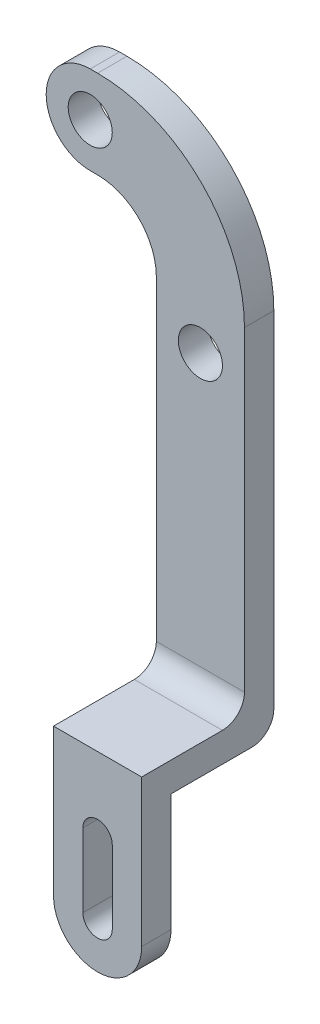
ISO-10303-21;
HEADER;
FILE_DESCRIPTION(('STEP AP214'),'2;1');
FILE_NAME('part.step','',(''),(''),'','','');
FILE_SCHEMA(('AUTOMOTIVE_DESIGN { 1 0 10303 214 1 1 1 1 }'));
ENDSEC;
DATA;
#1=APPLICATION_CONTEXT('core data for automotive mechanical design processes');
#2=APPLICATION_PROTOCOL_DEFINITION('international standard','automotive_design',2000,#1);
#3=PRODUCT_CONTEXT('',#1,'mechanical');
#4=PRODUCT('Part','Part','',(#3));
#5=PRODUCT_RELATED_PRODUCT_CATEGORY('part','',(#4));
#6=PRODUCT_DEFINITION_FORMATION('','',#4);
#7=PRODUCT_DEFINITION_CONTEXT('part definition',#1,'design');
#8=PRODUCT_DEFINITION('design','',#6,#7);
#9=PRODUCT_DEFINITION_SHAPE('','',#8);
#10=(LENGTH_UNIT() NAMED_UNIT(*) SI_UNIT(.MILLI.,.METRE.));
#11=(NAMED_UNIT(*) PLANE_ANGLE_UNIT() SI_UNIT($,.RADIAN.));
#12=(NAMED_UNIT(*) SI_UNIT($,.STERADIAN.) SOLID_ANGLE_UNIT());
#13=UNCERTAINTY_MEASURE_WITH_UNIT(LENGTH_MEASURE(1.E-05),#10,'distance_accuracy_value','');
#14=(GEOMETRIC_REPRESENTATION_CONTEXT(3) GLOBAL_UNCERTAINTY_ASSIGNED_CONTEXT((#13)) GLOBAL_UNIT_ASSIGNED_CONTEXT((#10,
#11,#12)) REPRESENTATION_CONTEXT('',''));
#15=CARTESIAN_POINT('',(0.,0.,0.));
#16=DIRECTION('',(0.,0.,1.));
#17=DIRECTION('',(1.,0.,0.));
#18=AXIS2_PLACEMENT_3D('',#15,#16,#17);
#19=CARTESIAN_POINT('',(-90.6722088265984,8.59964606378788,4.));
#20=DIRECTION('',(0.,0.,-1.));
#21=DIRECTION('',(-1.,0.,0.));
#22=AXIS2_PLACEMENT_3D('',#19,#20,#21);
#23=CYLINDRICAL_SURFACE('',#22,6.00000000000001);
#24=CARTESIAN_POINT('',(-90.6722088265984,8.59964606378788,14.));
#25=DIRECTION('',(0.,0.,-1.));
#26=DIRECTION('',(-1.,0.,0.));
#27=AXIS2_PLACEMENT_3D('',#24,#25,#26);
#28=CIRCLE('',#27,6.00000000000001);
#29=CARTESIAN_POINT('',(-84.6722088265984,8.59964606378788,14.));
#30=VERTEX_POINT('',#29);
#31=CARTESIAN_POINT('',(-96.6722088265984,8.59964606378788,14.));
#32=VERTEX_POINT('',#31);
#33=EDGE_CURVE('E571',#30,#32,#28,.T.);
#34=ORIENTED_EDGE('',*,*,#33,.F.);
#35=DIRECTION('',(0.,0.,-1.));
#36=VECTOR('',#35,1.);
#37=CARTESIAN_POINT('',(-84.6722088265984,8.59964606378788,4.));
#38=LINE('',#37,#36);
#39=CARTESIAN_POINT('',(-84.6722088265984,8.59964606378788,18.));
#40=VERTEX_POINT('',#39);
#41=EDGE_CURVE('E247',#40,#30,#38,.T.);
#42=ORIENTED_EDGE('',*,*,#41,.F.);
#43=CARTESIAN_POINT('',(-90.6722088265984,8.59964606378788,18.));
#44=DIRECTION('',(0.,0.,-1.));
#45=DIRECTION('',(-1.,0.,0.));
#46=AXIS2_PLACEMENT_3D('',#43,#44,#45);
#47=CIRCLE('',#46,6.00000000000001);
#48=CARTESIAN_POINT('',(-96.6722088265984,8.59964606378788,18.));
#49=VERTEX_POINT('',#48);
#50=EDGE_CURVE('E314',#40,#49,#47,.T.);
#51=ORIENTED_EDGE('',*,*,#50,.T.);
#52=DIRECTION('',(0.,0.,-1.));
#53=VECTOR('',#52,1.);
#54=CARTESIAN_POINT('',(-96.6722088265984,8.59964606378788,4.));
#55=LINE('',#54,#53);
#56=EDGE_CURVE('E238',#49,#32,#55,.T.);
#57=ORIENTED_EDGE('',*,*,#56,.T.);
#58=EDGE_LOOP('',(#34,#42,#51,#57));
#59=FACE_BOUND('',#58,.T.);
#60=ADVANCED_FACE('F32',(#59),#23,.T.);
#61=CARTESIAN_POINT('',(-90.6722088265984,8.59964606378788,4.));
#62=DIRECTION('',(0.,0.,-1.));
#63=DIRECTION('',(-1.,0.,0.));
#64=AXIS2_PLACEMENT_3D('',#61,#62,#63);
#65=CYLINDRICAL_SURFACE('',#64,2.);
#66=DIRECTION('',(0.,0.,-1.));
#67=VECTOR('',#66,1.);
#68=CARTESIAN_POINT('',(-88.6722088265984,8.59964606378788,4.));
#69=LINE('',#68,#67);
#70=CARTESIAN_POINT('',(-88.6722088265984,8.59964606378788,18.));
#71=VERTEX_POINT('',#70);
#72=CARTESIAN_POINT('',(-88.6722088265984,8.59964606378788,14.));
#73=VERTEX_POINT('',#72);
#74=EDGE_CURVE('E174',#71,#73,#69,.T.);
#75=ORIENTED_EDGE('',*,*,#74,.T.);
#76=CARTESIAN_POINT('',(-90.6722088265984,8.59964606378788,14.));
#77=DIRECTION('',(0.,0.,-1.));
#78=DIRECTION('',(-1.,0.,0.));
#79=AXIS2_PLACEMENT_3D('',#76,#77,#78);
#80=CIRCLE('',#79,2.);
#81=CARTESIAN_POINT('',(-92.6722088265984,8.59964606378788,14.));
#82=VERTEX_POINT('',#81);
#83=EDGE_CURVE('E160',#73,#82,#80,.T.);
#84=ORIENTED_EDGE('',*,*,#83,.T.);
#85=DIRECTION('',(0.,0.,-1.));
#86=VECTOR('',#85,1.);
#87=CARTESIAN_POINT('',(-92.6722088265984,8.59964606378788,4.));
#88=LINE('',#87,#86);
#89=CARTESIAN_POINT('',(-92.6722088265984,8.59964606378788,18.));
#90=VERTEX_POINT('',#89);
#91=EDGE_CURVE('E172',#90,#82,#88,.T.);
#92=ORIENTED_EDGE('',*,*,#91,.F.);
#93=CARTESIAN_POINT('',(-90.6722088265984,8.59964606378788,18.));
#94=DIRECTION('',(0.,0.,-1.));
#95=DIRECTION('',(-1.,0.,0.));
#96=AXIS2_PLACEMENT_3D('',#93,#94,#95);
#97=CIRCLE('',#96,2.);
#98=EDGE_CURVE('E298',#71,#90,#97,.T.);
#99=ORIENTED_EDGE('',*,*,#98,.F.);
#100=EDGE_LOOP('',(#75,#84,#92,#99));
#101=FACE_BOUND('',#100,.T.);
#102=ADVANCED_FACE('F170',(#101),#65,.F.);
#103=CARTESIAN_POINT('',(-88.6722088265984,8.59964606378788,4.));
#104=DIRECTION('',(-1.,0.,0.));
#105=DIRECTION('',(0.,0.,1.));
#106=AXIS2_PLACEMENT_3D('',#103,#104,#105);
#107=PLANE('',#106);
#108=DIRECTION('',(0.,0.,-1.));
#109=VECTOR('',#108,1.);
#110=CARTESIAN_POINT('',(-88.6722088265984,18.5996460637879,4.));
#111=LINE('',#110,#109);
#112=CARTESIAN_POINT('',(-88.6722088265984,18.5996460637879,18.));
#113=VERTEX_POINT('',#112);
#114=CARTESIAN_POINT('',(-88.6722088265984,18.5996460637879,14.));
#115=VERTEX_POINT('',#114);
#116=EDGE_CURVE('E183',#113,#115,#111,.T.);
#117=ORIENTED_EDGE('',*,*,#116,.T.);
#118=DIRECTION('',(0.,-1.,0.));
#119=VECTOR('',#118,1.);
#120=CARTESIAN_POINT('',(-88.6722088265984,8.59964606378788,14.));
#121=LINE('',#120,#119);
#122=EDGE_CURVE('E574',#115,#73,#121,.T.);
#123=ORIENTED_EDGE('',*,*,#122,.T.);
#124=ORIENTED_EDGE('',*,*,#74,.F.);
#125=DIRECTION('',(0.,-1.,0.));
#126=VECTOR('',#125,1.);
#127=CARTESIAN_POINT('',(-88.6722088265984,8.59964606378788,18.));
#128=LINE('',#127,#126);
#129=EDGE_CURVE('E309',#113,#71,#128,.T.);
#130=ORIENTED_EDGE('',*,*,#129,.F.);
#131=EDGE_LOOP('',(#117,#123,#124,#130));
#132=FACE_BOUND('',#131,.T.);
#133=ADVANCED_FACE('F349',(#132),#107,.T.);
#134=CARTESIAN_POINT('',(-90.6722088265984,18.5996460637879,4.));
#135=DIRECTION('',(0.,0.,-1.));
#136=DIRECTION('',(-1.,0.,0.));
#137=AXIS2_PLACEMENT_3D('',#134,#135,#136);
#138=CYLINDRICAL_SURFACE('',#137,2.);
#139=DIRECTION('',(0.,0.,-1.));
#140=VECTOR('',#139,1.);
#141=CARTESIAN_POINT('',(-92.6722088265984,18.5996460637879,4.));
#142=LINE('',#141,#140);
#143=CARTESIAN_POINT('',(-92.6722088265984,18.5996460637879,18.));
#144=VERTEX_POINT('',#143);
#145=CARTESIAN_POINT('',(-92.6722088265984,18.5996460637879,14.));
#146=VERTEX_POINT('',#145);
#147=EDGE_CURVE('E180',#144,#146,#142,.T.);
#148=ORIENTED_EDGE('',*,*,#147,.T.);
#149=CARTESIAN_POINT('',(-90.6722088265984,18.5996460637879,14.));
#150=DIRECTION('',(0.,0.,-1.));
#151=DIRECTION('',(-1.,0.,0.));
#152=AXIS2_PLACEMENT_3D('',#149,#150,#151);
#153=CIRCLE('',#152,2.);
#154=EDGE_CURVE('E163',#146,#115,#153,.T.);
#155=ORIENTED_EDGE('',*,*,#154,.T.);
#156=ORIENTED_EDGE('',*,*,#116,.F.);
#157=CARTESIAN_POINT('',(-90.6722088265984,18.5996460637879,18.));
#158=DIRECTION('',(0.,0.,-1.));
#159=DIRECTION('',(-1.,0.,0.));
#160=AXIS2_PLACEMENT_3D('',#157,#158,#159);
#161=CIRCLE('',#160,2.);
#162=EDGE_CURVE('E306',#144,#113,#161,.T.);
#163=ORIENTED_EDGE('',*,*,#162,.F.);
#164=EDGE_LOOP('',(#148,#155,#156,#163));
#165=FACE_BOUND('',#164,.T.);
#166=ADVANCED_FACE('F417',(#165),#138,.F.);
#167=CARTESIAN_POINT('',(-92.6722088265984,8.59964606378788,4.));
#168=DIRECTION('',(1.,0.,0.));
#169=DIRECTION('',(0.,0.,-1.));
#170=AXIS2_PLACEMENT_3D('',#167,#168,#169);
#171=PLANE('',#170);
#172=ORIENTED_EDGE('',*,*,#91,.T.);
#173=DIRECTION('',(0.,1.,0.));
#174=VECTOR('',#173,1.);
#175=CARTESIAN_POINT('',(-92.6722088265984,18.5996460637879,14.));
#176=LINE('',#175,#174);
#177=EDGE_CURVE('E156',#82,#146,#176,.T.);
#178=ORIENTED_EDGE('',*,*,#177,.T.);
#179=ORIENTED_EDGE('',*,*,#147,.F.);
#180=DIRECTION('',(0.,1.,0.));
#181=VECTOR('',#180,1.);
#182=CARTESIAN_POINT('',(-92.6722088265984,18.5996460637879,18.));
#183=LINE('',#182,#181);
#184=EDGE_CURVE('E178',#90,#144,#183,.T.);
#185=ORIENTED_EDGE('',*,*,#184,.F.);
#186=EDGE_LOOP('',(#172,#178,#179,#185));
#187=FACE_BOUND('',#186,.T.);
#188=ADVANCED_FACE('F176',(#187),#171,.T.);
#189=CARTESIAN_POINT('',(-90.6722088265984,8.59964606378788,4.));
#190=DIRECTION('',(0.,0.,1.));
#191=DIRECTION('',(1.,0.,0.));
#192=AXIS2_PLACEMENT_3D('',#189,#190,#191);
#193=PLANE('',#192);
#194=CARTESIAN_POINT('',(-105.672208826598,88.5996460637879,4.));
#195=DIRECTION('',(0.,0.,1.));
#196=DIRECTION('',(1.,0.,0.));
#197=AXIS2_PLACEMENT_3D('',#194,#195,#196);
#198=CIRCLE('',#197,3.00000000000001);
#199=CARTESIAN_POINT('',(-102.672208826598,88.5996460637879,4.));
#200=VERTEX_POINT('',#199);
#201=EDGE_CURVE('E321',#200,#200,#198,.T.);
#202=ORIENTED_EDGE('',*,*,#201,.F.);
#203=EDGE_LOOP('',(#202));
#204=FACE_BOUND('',#203,.T.);
#205=CARTESIAN_POINT('',(-90.6722088265984,68.5996460637879,4.));
#206=DIRECTION('',(0.,0.,1.));
#207=DIRECTION('',(1.,0.,0.));
#208=AXIS2_PLACEMENT_3D('',#205,#206,#207);
#209=CIRCLE('',#208,3.00000000000001);
#210=CARTESIAN_POINT('',(-87.6722088265984,68.5996460637879,4.));
#211=VERTEX_POINT('',#210);
#212=EDGE_CURVE('E181',#211,#211,#209,.T.);
#213=ORIENTED_EDGE('',*,*,#212,.F.);
#214=EDGE_LOOP('',(#213));
#215=FACE_BOUND('',#214,.T.);
#216=DIRECTION('',(0.,-1.,0.));
#217=VECTOR('',#216,1.);
#218=CARTESIAN_POINT('',(-96.6722088265984,8.59964606378788,4.));
#219=LINE('',#218,#217);
#220=CARTESIAN_POINT('',(-96.6722088265984,74.5996460637879,4.));
#221=VERTEX_POINT('',#220);
#222=CARTESIAN_POINT('',(-96.6722088265984,31.5996460637879,4.));
#223=VERTEX_POINT('',#222);
#224=EDGE_CURVE('E233',#221,#223,#219,.T.);
#225=ORIENTED_EDGE('',*,*,#224,.T.);
#226=DIRECTION('',(1.,0.,0.));
#227=VECTOR('',#226,1.);
#228=CARTESIAN_POINT('',(-84.6722088265984,31.5996460637879,4.));
#229=LINE('',#228,#227);
#230=CARTESIAN_POINT('',(-84.6722088265984,31.5996460637879,4.));
#231=VERTEX_POINT('',#230);
#232=EDGE_CURVE('E211',#223,#231,#229,.T.);
#233=ORIENTED_EDGE('',*,*,#232,.T.);
#234=DIRECTION('',(0.,1.,0.));
#235=VECTOR('',#234,1.);
#236=CARTESIAN_POINT('',(-84.6722088265984,8.59964606378788,4.));
#237=LINE('',#236,#235);
#238=CARTESIAN_POINT('',(-84.6722088265984,74.5996460637879,4.));
#239=VERTEX_POINT('',#238);
#240=EDGE_CURVE('E199',#231,#239,#237,.T.);
#241=ORIENTED_EDGE('',*,*,#240,.T.);
#242=CARTESIAN_POINT('',(-104.672208826598,74.5996460637879,4.));
#243=DIRECTION('',(0.,0.,1.));
#244=DIRECTION('',(1.,0.,0.));
#245=AXIS2_PLACEMENT_3D('',#242,#243,#244);
#246=CIRCLE('',#245,20.);
#247=CARTESIAN_POINT('',(-104.672208826598,94.5996460637879,4.));
#248=VERTEX_POINT('',#247);
#249=EDGE_CURVE('E196',#239,#248,#246,.T.);
#250=ORIENTED_EDGE('',*,*,#249,.T.);
#251=DIRECTION('',(-1.,0.,0.));
#252=VECTOR('',#251,1.);
#253=CARTESIAN_POINT('',(-105.672208826598,94.5996460637879,4.));
#254=LINE('',#253,#252);
#255=CARTESIAN_POINT('',(-105.672208826598,94.5996460637879,4.));
#256=VERTEX_POINT('',#255);
#257=EDGE_CURVE('E371',#248,#256,#254,.T.);
#258=ORIENTED_EDGE('',*,*,#257,.T.);
#259=CARTESIAN_POINT('',(-105.672208826598,88.5996460637879,4.));
#260=DIRECTION('',(0.,0.,1.));
#261=DIRECTION('',(1.,0.,0.));
#262=AXIS2_PLACEMENT_3D('',#259,#260,#261);
#263=CIRCLE('',#262,6.00000000000001);
#264=CARTESIAN_POINT('',(-105.672208826598,82.5996460637879,4.));
#265=VERTEX_POINT('',#264);
#266=EDGE_CURVE('E372',#256,#265,#263,.T.);
#267=ORIENTED_EDGE('',*,*,#266,.T.);
#268=DIRECTION('',(1.,0.,0.));
#269=VECTOR('',#268,1.);
#270=CARTESIAN_POINT('',(-105.672208826598,82.5996460637879,4.));
#271=LINE('',#270,#269);
#272=CARTESIAN_POINT('',(-104.672208826598,82.5996460637879,4.));
#273=VERTEX_POINT('',#272);
#274=EDGE_CURVE('E243',#265,#273,#271,.T.);
#275=ORIENTED_EDGE('',*,*,#274,.T.);
#276=CARTESIAN_POINT('',(-104.672208826598,74.5996460637879,4.));
#277=DIRECTION('',(0.,0.,-1.));
#278=DIRECTION('',(1.,0.,0.));
#279=AXIS2_PLACEMENT_3D('',#276,#277,#278);
#280=CIRCLE('',#279,8.00000000000001);
#281=EDGE_CURVE('E235',#273,#221,#280,.T.);
#282=ORIENTED_EDGE('',*,*,#281,.T.);
#283=EDGE_LOOP('',(#225,#233,#241,#250,#258,#267,#275,#282));
#284=FACE_BOUND('',#283,.T.);
#285=ADVANCED_FACE('F232',(#204,#215,#284),#193,.T.);
#286=CARTESIAN_POINT('',(-90.6722088265984,8.59964606378788,0.));
#287=DIRECTION('',(0.,0.,1.));
#288=DIRECTION('',(1.,0.,0.));
#289=AXIS2_PLACEMENT_3D('',#286,#287,#288);
#290=PLANE('',#289);
#291=CARTESIAN_POINT('',(-90.6722088265984,68.5996460637879,0.));
#292=DIRECTION('',(0.,0.,1.));
#293=DIRECTION('',(1.,0.,0.));
#294=AXIS2_PLACEMENT_3D('',#291,#292,#293);
#295=CIRCLE('',#294,3.00000000000001);
#296=CARTESIAN_POINT('',(-87.6722088265984,68.5996460637879,0.));
#297=VERTEX_POINT('',#296);
#298=EDGE_CURVE('E186',#297,#297,#295,.T.);
#299=ORIENTED_EDGE('',*,*,#298,.T.);
#300=EDGE_LOOP('',(#299));
#301=FACE_BOUND('',#300,.T.);
#302=DIRECTION('',(0.,1.,0.));
#303=VECTOR('',#302,1.);
#304=CARTESIAN_POINT('',(-84.6722088265984,8.59964606378788,0.));
#305=LINE('',#304,#303);
#306=CARTESIAN_POINT('',(-84.6722088265984,27.5996460637879,0.));
#307=VERTEX_POINT('',#306);
#308=CARTESIAN_POINT('',(-84.6722088265984,74.5996460637879,0.));
#309=VERTEX_POINT('',#308);
#310=EDGE_CURVE('E193',#307,#309,#305,.T.);
#311=ORIENTED_EDGE('',*,*,#310,.F.);
#312=DIRECTION('',(1.,0.,0.));
#313=VECTOR('',#312,1.);
#314=CARTESIAN_POINT('',(-90.6722088265984,27.5996460637879,0.));
#315=LINE('',#314,#313);
#316=CARTESIAN_POINT('',(-96.6722088265984,27.5996460637879,0.));
#317=VERTEX_POINT('',#316);
#318=EDGE_CURVE('E207',#307,#317,#315,.F.);
#319=ORIENTED_EDGE('',*,*,#318,.T.);
#320=DIRECTION('',(0.,-1.,0.));
#321=VECTOR('',#320,1.);
#322=CARTESIAN_POINT('',(-96.6722088265984,8.59964606378788,0.));
#323=LINE('',#322,#321);
#324=CARTESIAN_POINT('',(-96.6722088265984,74.5996460637879,0.));
#325=VERTEX_POINT('',#324);
#326=EDGE_CURVE('E202',#325,#317,#323,.T.);
#327=ORIENTED_EDGE('',*,*,#326,.F.);
#328=CARTESIAN_POINT('',(-104.672208826598,74.5996460637879,0.));
#329=DIRECTION('',(0.,0.,-1.));
#330=DIRECTION('',(1.,0.,0.));
#331=AXIS2_PLACEMENT_3D('',#328,#329,#330);
#332=CIRCLE('',#331,8.00000000000001);
#333=CARTESIAN_POINT('',(-104.672208826598,82.5996460637879,0.));
#334=VERTEX_POINT('',#333);
#335=EDGE_CURVE('E262',#334,#325,#332,.T.);
#336=ORIENTED_EDGE('',*,*,#335,.F.);
#337=DIRECTION('',(1.,0.,0.));
#338=VECTOR('',#337,1.);
#339=CARTESIAN_POINT('',(-105.672208826598,82.5996460637879,0.));
#340=LINE('',#339,#338);
#341=CARTESIAN_POINT('',(-105.672208826598,82.5996460637879,0.));
#342=VERTEX_POINT('',#341);
#343=EDGE_CURVE('E260',#342,#334,#340,.T.);
#344=ORIENTED_EDGE('',*,*,#343,.F.);
#345=CARTESIAN_POINT('',(-105.672208826598,88.5996460637879,0.));
#346=DIRECTION('',(0.,0.,1.));
#347=DIRECTION('',(1.,0.,0.));
#348=AXIS2_PLACEMENT_3D('',#345,#346,#347);
#349=CIRCLE('',#348,6.00000000000001);
#350=CARTESIAN_POINT('',(-105.672208826598,94.5996460637879,0.));
#351=VERTEX_POINT('',#350);
#352=EDGE_CURVE('E258',#351,#342,#349,.T.);
#353=ORIENTED_EDGE('',*,*,#352,.F.);
#354=DIRECTION('',(-1.,0.,0.));
#355=VECTOR('',#354,1.);
#356=CARTESIAN_POINT('',(-105.672208826598,94.5996460637879,0.));
#357=LINE('',#356,#355);
#358=CARTESIAN_POINT('',(-104.672208826598,94.5996460637879,0.));
#359=VERTEX_POINT('',#358);
#360=EDGE_CURVE('E256',#359,#351,#357,.T.);
#361=ORIENTED_EDGE('',*,*,#360,.F.);
#362=CARTESIAN_POINT('',(-104.672208826598,74.5996460637879,0.));
#363=DIRECTION('',(0.,0.,1.));
#364=DIRECTION('',(1.,0.,0.));
#365=AXIS2_PLACEMENT_3D('',#362,#363,#364);
#366=CIRCLE('',#365,20.);
#367=EDGE_CURVE('E254',#309,#359,#366,.T.);
#368=ORIENTED_EDGE('',*,*,#367,.F.);
#369=EDGE_LOOP('',(#311,#319,#327,#336,#344,#353,#361,#368));
#370=FACE_BOUND('',#369,.T.);
#371=CARTESIAN_POINT('',(-105.672208826598,88.5996460637879,0.));
#372=DIRECTION('',(0.,0.,1.));
#373=DIRECTION('',(1.,0.,0.));
#374=AXIS2_PLACEMENT_3D('',#371,#372,#373);
#375=CIRCLE('',#374,3.00000000000001);
#376=CARTESIAN_POINT('',(-102.672208826598,88.5996460637879,0.));
#377=VERTEX_POINT('',#376);
#378=EDGE_CURVE('E228',#377,#377,#375,.T.);
#379=ORIENTED_EDGE('',*,*,#378,.T.);
#380=EDGE_LOOP('',(#379));
#381=FACE_BOUND('',#380,.T.);
#382=ADVANCED_FACE('F327',(#301,#370,#381),#290,.F.);
#383=CARTESIAN_POINT('',(-84.6722088265984,8.59964606378788,4.));
#384=DIRECTION('',(-1.,0.,0.));
#385=DIRECTION('',(0.,0.,1.));
#386=AXIS2_PLACEMENT_3D('',#383,#384,#385);
#387=PLANE('',#386);
#388=DIRECTION('',(0.,0.,-1.));
#389=VECTOR('',#388,1.);
#390=CARTESIAN_POINT('',(-84.6722088265984,24.5996460637879,14.));
#391=LINE('',#390,#389);
#392=CARTESIAN_POINT('',(-84.6722088265984,24.5996460637879,14.));
#393=VERTEX_POINT('',#392);
#394=CARTESIAN_POINT('',(-84.6722088265984,24.5996460637879,3.));
#395=VERTEX_POINT('',#394);
#396=EDGE_CURVE('E290',#393,#395,#391,.T.);
#397=ORIENTED_EDGE('',*,*,#396,.T.);
#398=CARTESIAN_POINT('',(-84.6722088265984,27.5996460637879,3.));
#399=DIRECTION('',(-1.,0.,0.));
#400=DIRECTION('',(0.,0.,1.));
#401=AXIS2_PLACEMENT_3D('',#398,#399,#400);
#402=CIRCLE('',#401,3.);
#403=EDGE_CURVE('E205',#395,#307,#402,.F.);
#404=ORIENTED_EDGE('',*,*,#403,.T.);
#405=ORIENTED_EDGE('',*,*,#310,.T.);
#406=DIRECTION('',(0.,0.,-1.));
#407=VECTOR('',#406,1.);
#408=CARTESIAN_POINT('',(-84.6722088265984,74.5996460637879,4.));
#409=LINE('',#408,#407);
#410=EDGE_CURVE('E278',#239,#309,#409,.T.);
#411=ORIENTED_EDGE('',*,*,#410,.F.);
#412=ORIENTED_EDGE('',*,*,#240,.F.);
#413=CARTESIAN_POINT('',(-84.6722088265984,31.5996460637879,7.));
#414=DIRECTION('',(-1.,0.,0.));
#415=DIRECTION('',(0.,0.,1.));
#416=AXIS2_PLACEMENT_3D('',#413,#414,#415);
#417=CIRCLE('',#416,3.);
#418=CARTESIAN_POINT('',(-84.6722088265984,28.5996460637879,7.));
#419=VERTEX_POINT('',#418);
#420=EDGE_CURVE('E40',#231,#419,#417,.T.);
#421=ORIENTED_EDGE('',*,*,#420,.T.);
#422=DIRECTION('',(0.,0.,-1.));
#423=VECTOR('',#422,1.);
#424=CARTESIAN_POINT('',(-84.6722088265984,28.5996460637879,18.));
#425=LINE('',#424,#423);
#426=CARTESIAN_POINT('',(-84.6722088265984,28.5996460637879,18.));
#427=VERTEX_POINT('',#426);
#428=EDGE_CURVE('E219',#427,#419,#425,.T.);
#429=ORIENTED_EDGE('',*,*,#428,.F.);
#430=DIRECTION('',(0.,-1.,0.));
#431=VECTOR('',#430,1.);
#432=CARTESIAN_POINT('',(-84.6722088265984,8.59964606378788,18.));
#433=LINE('',#432,#431);
#434=EDGE_CURVE('E312',#427,#40,#433,.T.);
#435=ORIENTED_EDGE('',*,*,#434,.T.);
#436=ORIENTED_EDGE('',*,*,#41,.T.);
#437=DIRECTION('',(0.,-1.,0.));
#438=VECTOR('',#437,1.);
#439=CARTESIAN_POINT('',(-84.6722088265984,8.59964606378788,14.));
#440=LINE('',#439,#438);
#441=EDGE_CURVE('E297',#393,#30,#440,.T.);
#442=ORIENTED_EDGE('',*,*,#441,.F.);
#443=EDGE_LOOP('',(#397,#404,#405,#411,#412,#421,#429,#435,#436,#442));
#444=FACE_BOUND('',#443,.T.);
#445=ADVANCED_FACE('F217',(#444),#387,.F.);
#446=CARTESIAN_POINT('',(-104.672208826598,74.5996460637879,4.));
#447=DIRECTION('',(0.,0.,-1.));
#448=DIRECTION('',(-1.,0.,0.));
#449=AXIS2_PLACEMENT_3D('',#446,#447,#448);
#450=CYLINDRICAL_SURFACE('',#449,20.);
#451=ORIENTED_EDGE('',*,*,#367,.T.);
#452=DIRECTION('',(0.,0.,-1.));
#453=VECTOR('',#452,1.);
#454=CARTESIAN_POINT('',(-104.672208826598,94.5996460637879,4.));
#455=LINE('',#454,#453);
#456=EDGE_CURVE('E276',#248,#359,#455,.T.);
#457=ORIENTED_EDGE('',*,*,#456,.F.);
#458=ORIENTED_EDGE('',*,*,#249,.F.);
#459=ORIENTED_EDGE('',*,*,#410,.T.);
#460=EDGE_LOOP('',(#451,#457,#458,#459));
#461=FACE_BOUND('',#460,.T.);
#462=ADVANCED_FACE('F369',(#461),#450,.T.);
#463=CARTESIAN_POINT('',(-105.672208826598,94.5996460637879,4.));
#464=DIRECTION('',(0.,-1.,0.));
#465=DIRECTION('',(0.,0.,-1.));
#466=AXIS2_PLACEMENT_3D('',#463,#464,#465);
#467=PLANE('',#466);
#468=ORIENTED_EDGE('',*,*,#360,.T.);
#469=DIRECTION('',(0.,0.,-1.));
#470=VECTOR('',#469,1.);
#471=CARTESIAN_POINT('',(-105.672208826598,94.5996460637879,4.));
#472=LINE('',#471,#470);
#473=EDGE_CURVE('E273',#256,#351,#472,.T.);
#474=ORIENTED_EDGE('',*,*,#473,.F.);
#475=ORIENTED_EDGE('',*,*,#257,.F.);
#476=ORIENTED_EDGE('',*,*,#456,.T.);
#477=EDGE_LOOP('',(#468,#474,#475,#476));
#478=FACE_BOUND('',#477,.T.);
#479=ADVANCED_FACE('F396',(#478),#467,.F.);
#480=CARTESIAN_POINT('',(-105.672208826598,88.5996460637879,4.));
#481=DIRECTION('',(0.,0.,-1.));
#482=DIRECTION('',(-1.,0.,0.));
#483=AXIS2_PLACEMENT_3D('',#480,#481,#482);
#484=CYLINDRICAL_SURFACE('',#483,6.00000000000001);
#485=ORIENTED_EDGE('',*,*,#352,.T.);
#486=DIRECTION('',(0.,0.,-1.));
#487=VECTOR('',#486,1.);
#488=CARTESIAN_POINT('',(-105.672208826598,82.5996460637879,4.));
#489=LINE('',#488,#487);
#490=EDGE_CURVE('E270',#265,#342,#489,.T.);
#491=ORIENTED_EDGE('',*,*,#490,.F.);
#492=ORIENTED_EDGE('',*,*,#266,.F.);
#493=ORIENTED_EDGE('',*,*,#473,.T.);
#494=EDGE_LOOP('',(#485,#491,#492,#493));
#495=FACE_BOUND('',#494,.T.);
#496=ADVANCED_FACE('F390',(#495),#484,.T.);
#497=CARTESIAN_POINT('',(-105.672208826598,82.5996460637879,4.));
#498=DIRECTION('',(0.,1.,0.));
#499=DIRECTION('',(-1.,0.,0.));
#500=AXIS2_PLACEMENT_3D('',#497,#498,#499);
#501=PLANE('',#500);
#502=ORIENTED_EDGE('',*,*,#343,.T.);
#503=DIRECTION('',(0.,0.,-1.));
#504=VECTOR('',#503,1.);
#505=CARTESIAN_POINT('',(-104.672208826598,82.5996460637879,4.));
#506=LINE('',#505,#504);
#507=EDGE_CURVE('E267',#273,#334,#506,.T.);
#508=ORIENTED_EDGE('',*,*,#507,.F.);
#509=ORIENTED_EDGE('',*,*,#274,.F.);
#510=ORIENTED_EDGE('',*,*,#490,.T.);
#511=EDGE_LOOP('',(#502,#508,#509,#510));
#512=FACE_BOUND('',#511,.T.);
#513=ADVANCED_FACE('F380',(#512),#501,.F.);
#514=CARTESIAN_POINT('',(-104.672208826598,74.5996460637879,4.));
#515=DIRECTION('',(0.,0.,-1.));
#516=DIRECTION('',(-1.,0.,0.));
#517=AXIS2_PLACEMENT_3D('',#514,#515,#516);
#518=CYLINDRICAL_SURFACE('',#517,8.00000000000001);
#519=ORIENTED_EDGE('',*,*,#335,.T.);
#520=DIRECTION('',(0.,0.,-1.));
#521=VECTOR('',#520,1.);
#522=CARTESIAN_POINT('',(-96.6722088265984,74.5996460637879,4.));
#523=LINE('',#522,#521);
#524=EDGE_CURVE('E241',#221,#325,#523,.T.);
#525=ORIENTED_EDGE('',*,*,#524,.F.);
#526=ORIENTED_EDGE('',*,*,#281,.F.);
#527=ORIENTED_EDGE('',*,*,#507,.T.);
#528=EDGE_LOOP('',(#519,#525,#526,#527));
#529=FACE_BOUND('',#528,.T.);
#530=ADVANCED_FACE('F382',(#529),#518,.F.);
#531=CARTESIAN_POINT('',(-96.6722088265984,8.59964606378788,4.));
#532=DIRECTION('',(1.,0.,0.));
#533=DIRECTION('',(0.,0.,-1.));
#534=AXIS2_PLACEMENT_3D('',#531,#532,#533);
#535=PLANE('',#534);
#536=ORIENTED_EDGE('',*,*,#326,.T.);
#537=CARTESIAN_POINT('',(-96.6722088265984,27.5996460637879,3.));
#538=DIRECTION('',(1.,0.,0.));
#539=DIRECTION('',(0.,0.,-1.));
#540=AXIS2_PLACEMENT_3D('',#537,#538,#539);
#541=CIRCLE('',#540,3.);
#542=CARTESIAN_POINT('',(-96.6722088265984,24.5996460637879,3.));
#543=VERTEX_POINT('',#542);
#544=EDGE_CURVE('E209',#317,#543,#541,.F.);
#545=ORIENTED_EDGE('',*,*,#544,.T.);
#546=DIRECTION('',(0.,0.,-1.));
#547=VECTOR('',#546,1.);
#548=CARTESIAN_POINT('',(-96.6722088265984,24.5996460637879,14.));
#549=LINE('',#548,#547);
#550=CARTESIAN_POINT('',(-96.6722088265984,24.5996460637879,14.));
#551=VERTEX_POINT('',#550);
#552=EDGE_CURVE('E293',#551,#543,#549,.T.);
#553=ORIENTED_EDGE('',*,*,#552,.F.);
#554=DIRECTION('',(0.,1.,0.));
#555=VECTOR('',#554,1.);
#556=CARTESIAN_POINT('',(-96.6722088265984,24.5996460637879,14.));
#557=LINE('',#556,#555);
#558=EDGE_CURVE('E573',#32,#551,#557,.T.);
#559=ORIENTED_EDGE('',*,*,#558,.F.);
#560=ORIENTED_EDGE('',*,*,#56,.F.);
#561=DIRECTION('',(0.,1.,0.));
#562=VECTOR('',#561,1.);
#563=CARTESIAN_POINT('',(-96.6722088265984,28.5996460637879,18.));
#564=LINE('',#563,#562);
#565=CARTESIAN_POINT('',(-96.6722088265984,28.5996460637879,18.));
#566=VERTEX_POINT('',#565);
#567=EDGE_CURVE('E317',#49,#566,#564,.T.);
#568=ORIENTED_EDGE('',*,*,#567,.T.);
#569=DIRECTION('',(0.,0.,-1.));
#570=VECTOR('',#569,1.);
#571=CARTESIAN_POINT('',(-96.6722088265984,28.5996460637879,18.));
#572=LINE('',#571,#570);
#573=CARTESIAN_POINT('',(-96.6722088265984,28.5996460637879,7.));
#574=VERTEX_POINT('',#573);
#575=EDGE_CURVE('E229',#566,#574,#572,.T.);
#576=ORIENTED_EDGE('',*,*,#575,.T.);
#577=CARTESIAN_POINT('',(-96.6722088265984,31.5996460637879,7.));
#578=DIRECTION('',(1.,0.,0.));
#579=DIRECTION('',(0.,0.,-1.));
#580=AXIS2_PLACEMENT_3D('',#577,#578,#579);
#581=CIRCLE('',#580,3.);
#582=EDGE_CURVE('E11',#574,#223,#581,.T.);
#583=ORIENTED_EDGE('',*,*,#582,.T.);
#584=ORIENTED_EDGE('',*,*,#224,.F.);
#585=ORIENTED_EDGE('',*,*,#524,.T.);
#586=EDGE_LOOP('',(#536,#545,#553,#559,#560,#568,#576,#583,#584,#585));
#587=FACE_BOUND('',#586,.T.);
#588=ADVANCED_FACE('F340',(#587),#535,.F.);
#589=CARTESIAN_POINT('',(-90.6722088265984,68.5996460637879,4.));
#590=DIRECTION('',(0.,0.,-1.));
#591=DIRECTION('',(-1.,0.,0.));
#592=AXIS2_PLACEMENT_3D('',#589,#590,#591);
#593=CYLINDRICAL_SURFACE('',#592,3.00000000000001);
#594=ORIENTED_EDGE('',*,*,#212,.T.);
#595=EDGE_LOOP('',(#594));
#596=FACE_BOUND('',#595,.T.);
#597=ORIENTED_EDGE('',*,*,#298,.F.);
#598=EDGE_LOOP('',(#597));
#599=FACE_BOUND('',#598,.T.);
#600=ADVANCED_FACE('F331',(#596,#599),#593,.F.);
#601=CARTESIAN_POINT('',(-105.672208826598,88.5996460637879,4.));
#602=DIRECTION('',(0.,0.,-1.));
#603=DIRECTION('',(-1.,0.,0.));
#604=AXIS2_PLACEMENT_3D('',#601,#602,#603);
#605=CYLINDRICAL_SURFACE('',#604,3.00000000000001);
#606=ORIENTED_EDGE('',*,*,#201,.T.);
#607=EDGE_LOOP('',(#606));
#608=FACE_BOUND('',#607,.T.);
#609=ORIENTED_EDGE('',*,*,#378,.F.);
#610=EDGE_LOOP('',(#609));
#611=FACE_BOUND('',#610,.T.);
#612=ADVANCED_FACE('F329',(#608,#611),#605,.F.);
#613=CARTESIAN_POINT('',(-84.6722088265984,28.5996460637879,18.));
#614=DIRECTION('',(0.,1.,0.));
#615=DIRECTION('',(0.,0.,1.));
#616=AXIS2_PLACEMENT_3D('',#613,#614,#615);
#617=PLANE('',#616);
#618=ORIENTED_EDGE('',*,*,#428,.T.);
#619=DIRECTION('',(1.,0.,0.));
#620=VECTOR('',#619,1.);
#621=CARTESIAN_POINT('',(-96.6722088265984,28.5996460637879,7.));
#622=LINE('',#621,#620);
#623=EDGE_CURVE('E53',#419,#574,#622,.F.);
#624=ORIENTED_EDGE('',*,*,#623,.T.);
#625=ORIENTED_EDGE('',*,*,#575,.F.);
#626=DIRECTION('',(1.,0.,0.));
#627=VECTOR('',#626,1.);
#628=CARTESIAN_POINT('',(-84.6722088265984,28.5996460637879,18.));
#629=LINE('',#628,#627);
#630=EDGE_CURVE('E227',#566,#427,#629,.T.);
#631=ORIENTED_EDGE('',*,*,#630,.T.);
#632=EDGE_LOOP('',(#618,#624,#625,#631));
#633=FACE_BOUND('',#632,.T.);
#634=ADVANCED_FACE('F225',(#633),#617,.T.);
#635=CARTESIAN_POINT('',(-90.6722088265984,8.59964606378788,18.));
#636=DIRECTION('',(0.,0.,-1.));
#637=DIRECTION('',(-1.,0.,0.));
#638=AXIS2_PLACEMENT_3D('',#635,#636,#637);
#639=PLANE('',#638);
#640=ORIENTED_EDGE('',*,*,#129,.T.);
#641=ORIENTED_EDGE('',*,*,#98,.T.);
#642=ORIENTED_EDGE('',*,*,#184,.T.);
#643=ORIENTED_EDGE('',*,*,#162,.T.);
#644=EDGE_LOOP('',(#640,#641,#642,#643));
#645=FACE_BOUND('',#644,.T.);
#646=ORIENTED_EDGE('',*,*,#434,.F.);
#647=ORIENTED_EDGE('',*,*,#630,.F.);
#648=ORIENTED_EDGE('',*,*,#567,.F.);
#649=ORIENTED_EDGE('',*,*,#50,.F.);
#650=EDGE_LOOP('',(#646,#647,#648,#649));
#651=FACE_BOUND('',#650,.T.);
#652=ADVANCED_FACE('F338',(#645,#651),#639,.F.);
#653=CARTESIAN_POINT('',(-84.6722088265984,24.5996460637879,14.));
#654=DIRECTION('',(0.,1.,0.));
#655=DIRECTION('',(0.,0.,1.));
#656=AXIS2_PLACEMENT_3D('',#653,#654,#655);
#657=PLANE('',#656);
#658=ORIENTED_EDGE('',*,*,#552,.T.);
#659=DIRECTION('',(1.,0.,0.));
#660=VECTOR('',#659,1.);
#661=CARTESIAN_POINT('',(-84.6722088265984,24.5996460637879,3.));
#662=LINE('',#661,#660);
#663=EDGE_CURVE('E203',#543,#395,#662,.T.);
#664=ORIENTED_EDGE('',*,*,#663,.T.);
#665=ORIENTED_EDGE('',*,*,#396,.F.);
#666=DIRECTION('',(1.,0.,0.));
#667=VECTOR('',#666,1.);
#668=CARTESIAN_POINT('',(-84.6722088265984,24.5996460637879,14.));
#669=LINE('',#668,#667);
#670=EDGE_CURVE('E576',#551,#393,#669,.T.);
#671=ORIENTED_EDGE('',*,*,#670,.F.);
#672=EDGE_LOOP('',(#658,#664,#665,#671));
#673=FACE_BOUND('',#672,.T.);
#674=ADVANCED_FACE('F289',(#673),#657,.F.);
#675=CARTESIAN_POINT('',(-90.6722088265984,8.59964606378788,14.));
#676=DIRECTION('',(0.,0.,-1.));
#677=DIRECTION('',(-1.,0.,0.));
#678=AXIS2_PLACEMENT_3D('',#675,#676,#677);
#679=PLANE('',#678);
#680=ORIENTED_EDGE('',*,*,#122,.F.);
#681=ORIENTED_EDGE('',*,*,#154,.F.);
#682=ORIENTED_EDGE('',*,*,#177,.F.);
#683=ORIENTED_EDGE('',*,*,#83,.F.);
#684=EDGE_LOOP('',(#680,#681,#682,#683));
#685=FACE_BOUND('',#684,.T.);
#686=ORIENTED_EDGE('',*,*,#33,.T.);
#687=ORIENTED_EDGE('',*,*,#558,.T.);
#688=ORIENTED_EDGE('',*,*,#670,.T.);
#689=ORIENTED_EDGE('',*,*,#441,.T.);
#690=EDGE_LOOP('',(#686,#687,#688,#689));
#691=FACE_BOUND('',#690,.T.);
#692=ADVANCED_FACE('F158',(#685,#691),#679,.T.);
#693=CARTESIAN_POINT('',(-84.6722088265984,27.5996460637879,3.));
#694=DIRECTION('',(1.,0.,0.));
#695=DIRECTION('',(0.,0.,-1.));
#696=AXIS2_PLACEMENT_3D('',#693,#694,#695);
#697=CYLINDRICAL_SURFACE('',#696,3.);
#698=ORIENTED_EDGE('',*,*,#544,.F.);
#699=ORIENTED_EDGE('',*,*,#318,.F.);
#700=ORIENTED_EDGE('',*,*,#403,.F.);
#701=ORIENTED_EDGE('',*,*,#663,.F.);
#702=EDGE_LOOP('',(#698,#699,#700,#701));
#703=FACE_BOUND('',#702,.T.);
#704=ADVANCED_FACE('F354',(#703),#697,.T.);
#705=CARTESIAN_POINT('',(-90.6722088265984,31.5996460637879,7.));
#706=DIRECTION('',(-1.,0.,0.));
#707=DIRECTION('',(0.,0.,1.));
#708=AXIS2_PLACEMENT_3D('',#705,#706,#707);
#709=CYLINDRICAL_SURFACE('',#708,3.);
#710=ORIENTED_EDGE('',*,*,#582,.F.);
#711=ORIENTED_EDGE('',*,*,#623,.F.);
#712=ORIENTED_EDGE('',*,*,#420,.F.);
#713=ORIENTED_EDGE('',*,*,#232,.F.);
#714=EDGE_LOOP('',(#710,#711,#712,#713));
#715=FACE_BOUND('',#714,.T.);
#716=ADVANCED_FACE('F34',(#715),#709,.F.);
#717=CLOSED_SHELL('',(#60,#102,#133,#166,#188,#285,#382,#445,#462,#479,#496,#513,#530,#588,#600,
#612,#634,#652,#674,#692,#704,#716));
#718=MANIFOLD_SOLID_BREP('B2',#717);
#719=ADVANCED_BREP_SHAPE_REPRESENTATION('',(#18,#718),#14);
#720=SHAPE_DEFINITION_REPRESENTATION(#9,#719);
ENDSEC;
END-ISO-10303-21;
